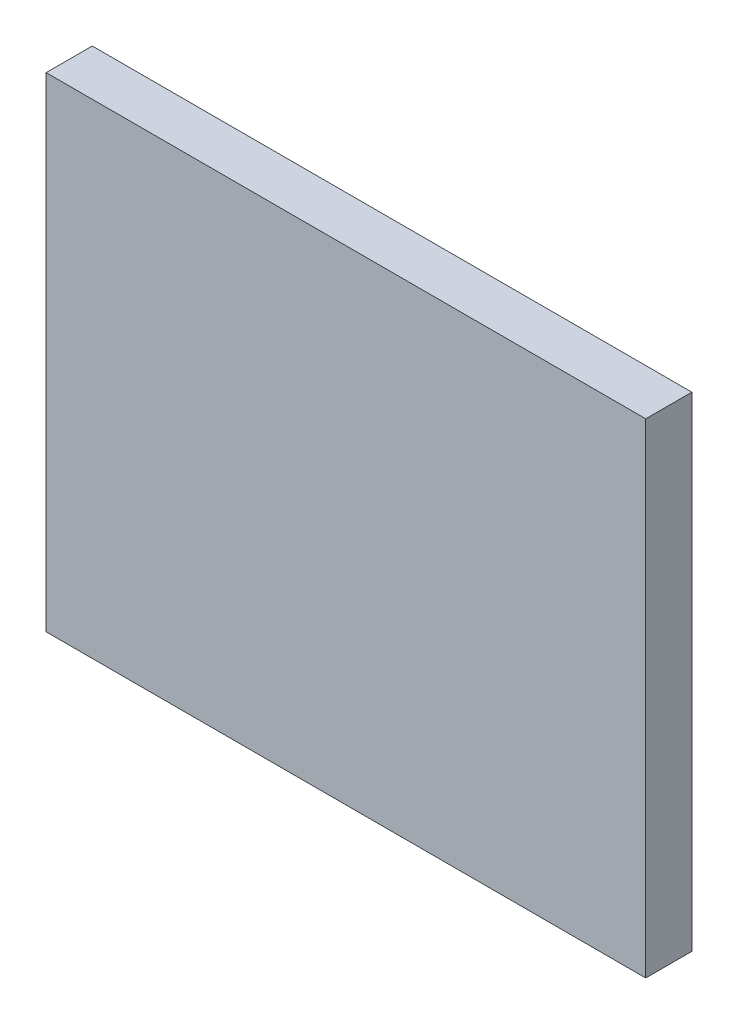
ISO-10303-21;
HEADER;
FILE_DESCRIPTION(('STEP AP214'),'2;1');
FILE_NAME('part.step','',(''),(''),'','','');
FILE_SCHEMA(('AUTOMOTIVE_DESIGN { 1 0 10303 214 1 1 1 1 }'));
ENDSEC;
DATA;
#1=APPLICATION_CONTEXT('core data for automotive mechanical design processes');
#2=APPLICATION_PROTOCOL_DEFINITION('international standard','automotive_design',2000,#1);
#3=PRODUCT_CONTEXT('',#1,'mechanical');
#4=PRODUCT('Part','Part','',(#3));
#5=PRODUCT_RELATED_PRODUCT_CATEGORY('part','',(#4));
#6=PRODUCT_DEFINITION_FORMATION('','',#4);
#7=PRODUCT_DEFINITION_CONTEXT('part definition',#1,'design');
#8=PRODUCT_DEFINITION('design','',#6,#7);
#9=PRODUCT_DEFINITION_SHAPE('','',#8);
#10=(LENGTH_UNIT() NAMED_UNIT(*) SI_UNIT(.MILLI.,.METRE.));
#11=(NAMED_UNIT(*) PLANE_ANGLE_UNIT() SI_UNIT($,.RADIAN.));
#12=(NAMED_UNIT(*) SI_UNIT($,.STERADIAN.) SOLID_ANGLE_UNIT());
#13=UNCERTAINTY_MEASURE_WITH_UNIT(LENGTH_MEASURE(1.E-05),#10,'distance_accuracy_value','');
#14=(GEOMETRIC_REPRESENTATION_CONTEXT(3) GLOBAL_UNCERTAINTY_ASSIGNED_CONTEXT((#13)) GLOBAL_UNIT_ASSIGNED_CONTEXT((#10,
#11,#12)) REPRESENTATION_CONTEXT('',''));
#15=CARTESIAN_POINT('',(0.,0.,0.));
#16=DIRECTION('',(0.,0.,1.));
#17=DIRECTION('',(1.,0.,0.));
#18=AXIS2_PLACEMENT_3D('',#15,#16,#17);
#19=CARTESIAN_POINT('',(-75.1575593575419,30.9567039106145,10.));
#20=DIRECTION('',(1.,0.,0.));
#21=DIRECTION('',(0.,1.,0.));
#22=AXIS2_PLACEMENT_3D('',#19,#20,#21);
#23=PLANE('',#22);
#24=DIRECTION('',(0.,-1.,0.));
#25=VECTOR('',#24,1.);
#26=CARTESIAN_POINT('',(-75.1575593575419,30.9567039106145,0.));
#27=LINE('',#26,#25);
#28=CARTESIAN_POINT('',(-75.1575593575419,30.9567039106145,0.));
#29=VERTEX_POINT('',#28);
#30=CARTESIAN_POINT('',(-75.1575593575419,-74.0432960893855,0.));
#31=VERTEX_POINT('',#30);
#32=EDGE_CURVE('E107',#29,#31,#27,.T.);
#33=ORIENTED_EDGE('',*,*,#32,.T.);
#34=DIRECTION('',(0.,0.,-1.));
#35=VECTOR('',#34,1.);
#36=CARTESIAN_POINT('',(-75.1575593575419,-74.0432960893855,10.));
#37=LINE('',#36,#35);
#38=CARTESIAN_POINT('',(-75.1575593575419,-74.0432960893855,10.));
#39=VERTEX_POINT('',#38);
#40=EDGE_CURVE('E11',#39,#31,#37,.T.);
#41=ORIENTED_EDGE('',*,*,#40,.F.);
#42=DIRECTION('',(0.,-1.,0.));
#43=VECTOR('',#42,1.);
#44=CARTESIAN_POINT('',(-75.1575593575419,30.9567039106145,10.));
#45=LINE('',#44,#43);
#46=CARTESIAN_POINT('',(-75.1575593575419,30.9567039106145,10.));
#47=VERTEX_POINT('',#46);
#48=EDGE_CURVE('E91',#47,#39,#45,.T.);
#49=ORIENTED_EDGE('',*,*,#48,.F.);
#50=DIRECTION('',(0.,0.,-1.));
#51=VECTOR('',#50,1.);
#52=CARTESIAN_POINT('',(-75.1575593575419,30.9567039106145,10.));
#53=LINE('',#52,#51);
#54=EDGE_CURVE('E103',#47,#29,#53,.T.);
#55=ORIENTED_EDGE('',*,*,#54,.T.);
#56=EDGE_LOOP('',(#33,#41,#49,#55));
#57=FACE_BOUND('',#56,.T.);
#58=ADVANCED_FACE('F39',(#57),#23,.F.);
#59=CARTESIAN_POINT('',(-75.1575593575419,-74.0432960893855,10.));
#60=DIRECTION('',(0.,1.,0.));
#61=DIRECTION('',(0.,0.,1.));
#62=AXIS2_PLACEMENT_3D('',#59,#60,#61);
#63=PLANE('',#62);
#64=DIRECTION('',(1.,0.,0.));
#65=VECTOR('',#64,1.);
#66=CARTESIAN_POINT('',(-75.1575593575419,-74.0432960893855,0.));
#67=LINE('',#66,#65);
#68=CARTESIAN_POINT('',(54.8424406424581,-74.0432960893855,0.));
#69=VERTEX_POINT('',#68);
#70=EDGE_CURVE('E96',#31,#69,#67,.T.);
#71=ORIENTED_EDGE('',*,*,#70,.T.);
#72=DIRECTION('',(0.,0.,-1.));
#73=VECTOR('',#72,1.);
#74=CARTESIAN_POINT('',(54.8424406424581,-74.0432960893855,10.));
#75=LINE('',#74,#73);
#76=CARTESIAN_POINT('',(54.8424406424581,-74.0432960893855,10.));
#77=VERTEX_POINT('',#76);
#78=EDGE_CURVE('E48',#77,#69,#75,.T.);
#79=ORIENTED_EDGE('',*,*,#78,.F.);
#80=DIRECTION('',(1.,0.,0.));
#81=VECTOR('',#80,1.);
#82=CARTESIAN_POINT('',(-75.1575593575419,-74.0432960893855,10.));
#83=LINE('',#82,#81);
#84=EDGE_CURVE('E86',#39,#77,#83,.T.);
#85=ORIENTED_EDGE('',*,*,#84,.F.);
#86=ORIENTED_EDGE('',*,*,#40,.T.);
#87=EDGE_LOOP('',(#71,#79,#85,#86));
#88=FACE_BOUND('',#87,.T.);
#89=ADVANCED_FACE('F95',(#88),#63,.F.);
#90=CARTESIAN_POINT('',(54.8424406424581,30.9567039106145,10.));
#91=DIRECTION('',(-1.,0.,0.));
#92=DIRECTION('',(0.,-1.,0.));
#93=AXIS2_PLACEMENT_3D('',#90,#91,#92);
#94=PLANE('',#93);
#95=DIRECTION('',(0.,1.,0.));
#96=VECTOR('',#95,1.);
#97=CARTESIAN_POINT('',(54.8424406424581,30.9567039106145,0.));
#98=LINE('',#97,#96);
#99=CARTESIAN_POINT('',(54.8424406424581,30.9567039106145,0.));
#100=VERTEX_POINT('',#99);
#101=EDGE_CURVE('E73',#69,#100,#98,.T.);
#102=ORIENTED_EDGE('',*,*,#101,.T.);
#103=DIRECTION('',(0.,0.,-1.));
#104=VECTOR('',#103,1.);
#105=CARTESIAN_POINT('',(54.8424406424581,30.9567039106145,10.));
#106=LINE('',#105,#104);
#107=CARTESIAN_POINT('',(54.8424406424581,30.9567039106145,10.));
#108=VERTEX_POINT('',#107);
#109=EDGE_CURVE('E98',#108,#100,#106,.T.);
#110=ORIENTED_EDGE('',*,*,#109,.F.);
#111=DIRECTION('',(0.,1.,0.));
#112=VECTOR('',#111,1.);
#113=CARTESIAN_POINT('',(54.8424406424581,30.9567039106145,10.));
#114=LINE('',#113,#112);
#115=EDGE_CURVE('E89',#77,#108,#114,.T.);
#116=ORIENTED_EDGE('',*,*,#115,.F.);
#117=ORIENTED_EDGE('',*,*,#78,.T.);
#118=EDGE_LOOP('',(#102,#110,#116,#117));
#119=FACE_BOUND('',#118,.T.);
#120=ADVANCED_FACE('F99',(#119),#94,.F.);
#121=CARTESIAN_POINT('',(-75.1575593575419,30.9567039106145,10.));
#122=DIRECTION('',(0.,-1.,0.));
#123=DIRECTION('',(0.,0.,-1.));
#124=AXIS2_PLACEMENT_3D('',#121,#122,#123);
#125=PLANE('',#124);
#126=DIRECTION('',(-1.,0.,0.));
#127=VECTOR('',#126,1.);
#128=CARTESIAN_POINT('',(-75.1575593575419,30.9567039106145,0.));
#129=LINE('',#128,#127);
#130=EDGE_CURVE('E79',#100,#29,#129,.T.);
#131=ORIENTED_EDGE('',*,*,#130,.T.);
#132=ORIENTED_EDGE('',*,*,#54,.F.);
#133=DIRECTION('',(-1.,0.,0.));
#134=VECTOR('',#133,1.);
#135=CARTESIAN_POINT('',(-75.1575593575419,30.9567039106145,10.));
#136=LINE('',#135,#134);
#137=EDGE_CURVE('E56',#108,#47,#136,.T.);
#138=ORIENTED_EDGE('',*,*,#137,.F.);
#139=ORIENTED_EDGE('',*,*,#109,.T.);
#140=EDGE_LOOP('',(#131,#132,#138,#139));
#141=FACE_BOUND('',#140,.T.);
#142=ADVANCED_FACE('F120',(#141),#125,.F.);
#143=CARTESIAN_POINT('',(0.,0.,10.));
#144=DIRECTION('',(0.,0.,1.));
#145=DIRECTION('',(1.,0.,0.));
#146=AXIS2_PLACEMENT_3D('',#143,#144,#145);
#147=PLANE('',#146);
#148=ORIENTED_EDGE('',*,*,#48,.T.);
#149=ORIENTED_EDGE('',*,*,#84,.T.);
#150=ORIENTED_EDGE('',*,*,#115,.T.);
#151=ORIENTED_EDGE('',*,*,#137,.T.);
#152=EDGE_LOOP('',(#148,#149,#150,#151));
#153=FACE_BOUND('',#152,.T.);
#154=ADVANCED_FACE('F87',(#153),#147,.T.);
#155=CARTESIAN_POINT('',(0.,0.,0.));
#156=DIRECTION('',(0.,0.,1.));
#157=DIRECTION('',(1.,0.,0.));
#158=AXIS2_PLACEMENT_3D('',#155,#156,#157);
#159=PLANE('',#158);
#160=ORIENTED_EDGE('',*,*,#32,.F.);
#161=ORIENTED_EDGE('',*,*,#130,.F.);
#162=ORIENTED_EDGE('',*,*,#101,.F.);
#163=ORIENTED_EDGE('',*,*,#70,.F.);
#164=EDGE_LOOP('',(#160,#161,#162,#163));
#165=FACE_BOUND('',#164,.T.);
#166=ADVANCED_FACE('F123',(#165),#159,.F.);
#167=CLOSED_SHELL('',(#58,#89,#120,#142,#154,#166));
#168=MANIFOLD_SOLID_BREP('B2',#167);
#169=ADVANCED_BREP_SHAPE_REPRESENTATION('',(#18,#168),#14);
#170=SHAPE_DEFINITION_REPRESENTATION(#9,#169);
ENDSEC;
END-ISO-10303-21;
